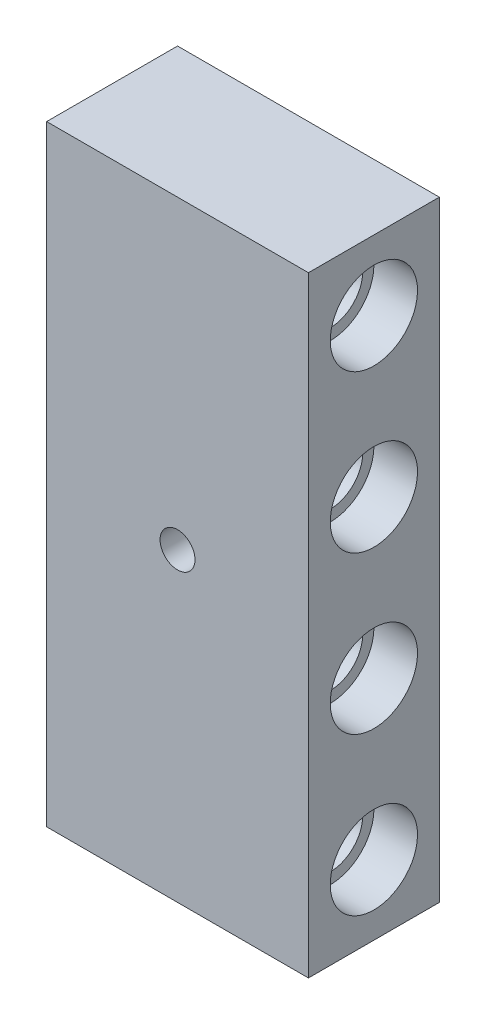
ISO-10303-21;
HEADER;
FILE_DESCRIPTION(('STEP AP214'),'2;1');
FILE_NAME('part.step','',(''),(''),'','','');
FILE_SCHEMA(('AUTOMOTIVE_DESIGN { 1 0 10303 214 1 1 1 1 }'));
ENDSEC;
DATA;
#1=APPLICATION_CONTEXT('core data for automotive mechanical design processes');
#2=APPLICATION_PROTOCOL_DEFINITION('international standard','automotive_design',2000,#1);
#3=PRODUCT_CONTEXT('',#1,'mechanical');
#4=PRODUCT('Part','Part','',(#3));
#5=PRODUCT_RELATED_PRODUCT_CATEGORY('part','',(#4));
#6=PRODUCT_DEFINITION_FORMATION('','',#4);
#7=PRODUCT_DEFINITION_CONTEXT('part definition',#1,'design');
#8=PRODUCT_DEFINITION('design','',#6,#7);
#9=PRODUCT_DEFINITION_SHAPE('','',#8);
#10=(LENGTH_UNIT() NAMED_UNIT(*) SI_UNIT(.MILLI.,.METRE.));
#11=(NAMED_UNIT(*) PLANE_ANGLE_UNIT() SI_UNIT($,.RADIAN.));
#12=(NAMED_UNIT(*) SI_UNIT($,.STERADIAN.) SOLID_ANGLE_UNIT());
#13=UNCERTAINTY_MEASURE_WITH_UNIT(LENGTH_MEASURE(1.E-05),#10,'distance_accuracy_value','');
#14=(GEOMETRIC_REPRESENTATION_CONTEXT(3) GLOBAL_UNCERTAINTY_ASSIGNED_CONTEXT((#13)) GLOBAL_UNIT_ASSIGNED_CONTEXT((#10,
#11,#12)) REPRESENTATION_CONTEXT('',''));
#15=CARTESIAN_POINT('',(0.,0.,0.));
#16=DIRECTION('',(0.,0.,1.));
#17=DIRECTION('',(1.,0.,0.));
#18=AXIS2_PLACEMENT_3D('',#15,#16,#17);
#19=CARTESIAN_POINT('',(0.,39.37,4.76249999999989));
#20=DIRECTION('',(1.,0.,0.));
#21=DIRECTION('',(0.,0.,-1.));
#22=AXIS2_PLACEMENT_3D('',#19,#20,#21);
#23=CYLINDRICAL_SURFACE('',#22,2.3622);
#24=CARTESIAN_POINT('',(15.875,39.37,4.76249999999989));
#25=DIRECTION('',(1.,0.,0.));
#26=DIRECTION('',(0.,1.,0.));
#27=AXIS2_PLACEMENT_3D('',#24,#25,#26);
#28=CIRCLE('',#27,2.3622);
#29=CARTESIAN_POINT('',(15.875,41.7322,4.76249999999989));
#30=VERTEX_POINT('',#29);
#31=EDGE_CURVE('E142',#30,#30,#28,.F.);
#32=ORIENTED_EDGE('',*,*,#31,.F.);
#33=EDGE_LOOP('',(#32));
#34=FACE_BOUND('',#33,.T.);
#35=CARTESIAN_POINT('',(3.175,39.37,4.76249999999989));
#36=DIRECTION('',(1.,0.,0.));
#37=DIRECTION('',(0.,1.,0.));
#38=AXIS2_PLACEMENT_3D('',#35,#36,#37);
#39=CIRCLE('',#38,2.3622);
#40=CARTESIAN_POINT('',(3.175,41.7322,4.76249999999989));
#41=VERTEX_POINT('',#40);
#42=EDGE_CURVE('E178',#41,#41,#39,.F.);
#43=ORIENTED_EDGE('',*,*,#42,.T.);
#44=EDGE_LOOP('',(#43));
#45=FACE_BOUND('',#44,.T.);
#46=ADVANCED_FACE('F33',(#34,#45),#23,.F.);
#47=CARTESIAN_POINT('',(0.,27.94,4.76249999999993));
#48=DIRECTION('',(1.,0.,0.));
#49=DIRECTION('',(0.,0.,-1.));
#50=AXIS2_PLACEMENT_3D('',#47,#48,#49);
#51=CYLINDRICAL_SURFACE('',#50,2.3622);
#52=CARTESIAN_POINT('',(15.875,27.94,4.76249999999993));
#53=DIRECTION('',(1.,0.,0.));
#54=DIRECTION('',(0.,1.,0.));
#55=AXIS2_PLACEMENT_3D('',#52,#53,#54);
#56=CIRCLE('',#55,2.3622);
#57=CARTESIAN_POINT('',(15.875,30.3022,4.76249999999993));
#58=VERTEX_POINT('',#57);
#59=EDGE_CURVE('E133',#58,#58,#56,.F.);
#60=ORIENTED_EDGE('',*,*,#59,.F.);
#61=EDGE_LOOP('',(#60));
#62=FACE_BOUND('',#61,.T.);
#63=CARTESIAN_POINT('',(3.175,27.94,4.76249999999993));
#64=DIRECTION('',(1.,0.,0.));
#65=DIRECTION('',(0.,1.,0.));
#66=AXIS2_PLACEMENT_3D('',#63,#64,#65);
#67=CIRCLE('',#66,2.3622);
#68=CARTESIAN_POINT('',(3.175,30.3022,4.76249999999993));
#69=VERTEX_POINT('',#68);
#70=EDGE_CURVE('E169',#69,#69,#67,.F.);
#71=ORIENTED_EDGE('',*,*,#70,.T.);
#72=EDGE_LOOP('',(#71));
#73=FACE_BOUND('',#72,.T.);
#74=ADVANCED_FACE('F227',(#62,#73),#51,.F.);
#75=CARTESIAN_POINT('',(0.,16.51,4.76249999999993));
#76=DIRECTION('',(1.,0.,0.));
#77=DIRECTION('',(0.,0.,-1.));
#78=AXIS2_PLACEMENT_3D('',#75,#76,#77);
#79=CYLINDRICAL_SURFACE('',#78,2.3622);
#80=CARTESIAN_POINT('',(15.875,16.51,4.76249999999993));
#81=DIRECTION('',(1.,0.,0.));
#82=DIRECTION('',(0.,1.,0.));
#83=AXIS2_PLACEMENT_3D('',#80,#81,#82);
#84=CIRCLE('',#83,2.3622);
#85=CARTESIAN_POINT('',(15.875,18.8722,4.76249999999993));
#86=VERTEX_POINT('',#85);
#87=EDGE_CURVE('E132',#86,#86,#84,.F.);
#88=ORIENTED_EDGE('',*,*,#87,.F.);
#89=EDGE_LOOP('',(#88));
#90=FACE_BOUND('',#89,.T.);
#91=CARTESIAN_POINT('',(3.175,16.51,4.76249999999993));
#92=DIRECTION('',(1.,0.,0.));
#93=DIRECTION('',(0.,1.,0.));
#94=AXIS2_PLACEMENT_3D('',#91,#92,#93);
#95=CIRCLE('',#94,2.3622);
#96=CARTESIAN_POINT('',(3.175,18.8722,4.76249999999993));
#97=VERTEX_POINT('',#96);
#98=EDGE_CURVE('E168',#97,#97,#95,.F.);
#99=ORIENTED_EDGE('',*,*,#98,.T.);
#100=EDGE_LOOP('',(#99));
#101=FACE_BOUND('',#100,.T.);
#102=ADVANCED_FACE('F233',(#90,#101),#79,.F.);
#103=CARTESIAN_POINT('',(0.,5.08,4.76249999999989));
#104=DIRECTION('',(1.,0.,0.));
#105=DIRECTION('',(0.,0.,-1.));
#106=AXIS2_PLACEMENT_3D('',#103,#104,#105);
#107=CYLINDRICAL_SURFACE('',#106,2.3622);
#108=CARTESIAN_POINT('',(15.875,5.08,4.76249999999989));
#109=DIRECTION('',(1.,0.,0.));
#110=DIRECTION('',(0.,1.,0.));
#111=AXIS2_PLACEMENT_3D('',#108,#109,#110);
#112=CIRCLE('',#111,2.3622);
#113=CARTESIAN_POINT('',(15.875,7.4422,4.76249999999989));
#114=VERTEX_POINT('',#113);
#115=EDGE_CURVE('E123',#114,#114,#112,.F.);
#116=ORIENTED_EDGE('',*,*,#115,.F.);
#117=EDGE_LOOP('',(#116));
#118=FACE_BOUND('',#117,.T.);
#119=CARTESIAN_POINT('',(3.175,5.08,4.76249999999989));
#120=DIRECTION('',(1.,0.,0.));
#121=DIRECTION('',(0.,1.,0.));
#122=AXIS2_PLACEMENT_3D('',#119,#120,#121);
#123=CIRCLE('',#122,2.3622);
#124=CARTESIAN_POINT('',(3.175,7.4422,4.76249999999989));
#125=VERTEX_POINT('',#124);
#126=EDGE_CURVE('E159',#125,#125,#123,.F.);
#127=ORIENTED_EDGE('',*,*,#126,.T.);
#128=EDGE_LOOP('',(#127));
#129=FACE_BOUND('',#128,.T.);
#130=ADVANCED_FACE('F253',(#118,#129),#107,.F.);
#131=CARTESIAN_POINT('',(19.05,0.,9.525));
#132=DIRECTION('',(-1.,0.,0.));
#133=DIRECTION('',(0.,-1.,0.));
#134=AXIS2_PLACEMENT_3D('',#131,#132,#133);
#135=PLANE('',#134);
#136=CARTESIAN_POINT('',(19.05,27.94,4.76249999999993));
#137=DIRECTION('',(1.,0.,0.));
#138=DIRECTION('',(0.,1.,0.));
#139=AXIS2_PLACEMENT_3D('',#136,#137,#138);
#140=CIRCLE('',#139,3.175);
#141=CARTESIAN_POINT('',(19.05,31.115,4.76249999999993));
#142=VERTEX_POINT('',#141);
#143=EDGE_CURVE('E138',#142,#142,#140,.F.);
#144=ORIENTED_EDGE('',*,*,#143,.T.);
#145=EDGE_LOOP('',(#144));
#146=FACE_BOUND('',#145,.T.);
#147=CARTESIAN_POINT('',(19.05,16.51,4.76249999999993));
#148=DIRECTION('',(1.,0.,0.));
#149=DIRECTION('',(0.,1.,0.));
#150=AXIS2_PLACEMENT_3D('',#147,#148,#149);
#151=CIRCLE('',#150,3.175);
#152=CARTESIAN_POINT('',(19.05,19.685,4.76249999999993));
#153=VERTEX_POINT('',#152);
#154=EDGE_CURVE('E129',#153,#153,#151,.T.);
#155=ORIENTED_EDGE('',*,*,#154,.F.);
#156=EDGE_LOOP('',(#155));
#157=FACE_BOUND('',#156,.T.);
#158=CARTESIAN_POINT('',(19.05,5.08,4.76249999999989));
#159=DIRECTION('',(1.,0.,0.));
#160=DIRECTION('',(0.,1.,0.));
#161=AXIS2_PLACEMENT_3D('',#158,#159,#160);
#162=CIRCLE('',#161,3.175);
#163=CARTESIAN_POINT('',(19.05,8.255,4.76249999999989));
#164=VERTEX_POINT('',#163);
#165=EDGE_CURVE('E120',#164,#164,#162,.T.);
#166=ORIENTED_EDGE('',*,*,#165,.F.);
#167=EDGE_LOOP('',(#166));
#168=FACE_BOUND('',#167,.T.);
#169=DIRECTION('',(0.,1.,0.));
#170=VECTOR('',#169,1.);
#171=CARTESIAN_POINT('',(19.05,0.,0.));
#172=LINE('',#171,#170);
#173=CARTESIAN_POINT('',(19.05,0.,0.));
#174=VERTEX_POINT('',#173);
#175=CARTESIAN_POINT('',(19.05,44.45,0.));
#176=VERTEX_POINT('',#175);
#177=EDGE_CURVE('E67',#174,#176,#172,.T.);
#178=ORIENTED_EDGE('',*,*,#177,.T.);
#179=DIRECTION('',(0.,0.,-1.));
#180=VECTOR('',#179,1.);
#181=CARTESIAN_POINT('',(19.05,44.45,9.525));
#182=LINE('',#181,#180);
#183=CARTESIAN_POINT('',(19.05,44.45,9.525));
#184=VERTEX_POINT('',#183);
#185=EDGE_CURVE('E91',#184,#176,#182,.T.);
#186=ORIENTED_EDGE('',*,*,#185,.F.);
#187=DIRECTION('',(0.,1.,0.));
#188=VECTOR('',#187,1.);
#189=CARTESIAN_POINT('',(19.05,0.,9.525));
#190=LINE('',#189,#188);
#191=CARTESIAN_POINT('',(19.05,0.,9.525));
#192=VERTEX_POINT('',#191);
#193=EDGE_CURVE('E84',#192,#184,#190,.T.);
#194=ORIENTED_EDGE('',*,*,#193,.F.);
#195=DIRECTION('',(0.,0.,-1.));
#196=VECTOR('',#195,1.);
#197=CARTESIAN_POINT('',(19.05,0.,9.525));
#198=LINE('',#197,#196);
#199=EDGE_CURVE('E42',#192,#174,#198,.T.);
#200=ORIENTED_EDGE('',*,*,#199,.T.);
#201=EDGE_LOOP('',(#178,#186,#194,#200));
#202=FACE_BOUND('',#201,.T.);
#203=CARTESIAN_POINT('',(19.05,39.37,4.76249999999989));
#204=DIRECTION('',(1.,0.,0.));
#205=DIRECTION('',(0.,1.,0.));
#206=AXIS2_PLACEMENT_3D('',#203,#204,#205);
#207=CIRCLE('',#206,3.175);
#208=CARTESIAN_POINT('',(19.05,42.545,4.76249999999989));
#209=VERTEX_POINT('',#208);
#210=EDGE_CURVE('E147',#209,#209,#207,.F.);
#211=ORIENTED_EDGE('',*,*,#210,.T.);
#212=EDGE_LOOP('',(#211));
#213=FACE_BOUND('',#212,.T.);
#214=ADVANCED_FACE('F92',(#146,#157,#168,#202,#213),#135,.F.);
#215=CARTESIAN_POINT('',(0.,0.,9.525));
#216=DIRECTION('',(0.,0.,-1.));
#217=DIRECTION('',(-1.,0.,0.));
#218=AXIS2_PLACEMENT_3D('',#215,#216,#217);
#219=PLANE('',#218);
#220=DIRECTION('',(0.,-1.,0.));
#221=VECTOR('',#220,1.);
#222=CARTESIAN_POINT('',(0.,0.,9.525));
#223=LINE('',#222,#221);
#224=CARTESIAN_POINT('',(0.,44.45,9.525));
#225=VERTEX_POINT('',#224);
#226=CARTESIAN_POINT('',(0.,0.,9.525));
#227=VERTEX_POINT('',#226);
#228=EDGE_CURVE('E86',#225,#227,#223,.T.);
#229=ORIENTED_EDGE('',*,*,#228,.T.);
#230=DIRECTION('',(1.,0.,0.));
#231=VECTOR('',#230,1.);
#232=CARTESIAN_POINT('',(0.,0.,9.525));
#233=LINE('',#232,#231);
#234=EDGE_CURVE('E80',#227,#192,#233,.T.);
#235=ORIENTED_EDGE('',*,*,#234,.T.);
#236=ORIENTED_EDGE('',*,*,#193,.T.);
#237=DIRECTION('',(-1.,0.,0.));
#238=VECTOR('',#237,1.);
#239=CARTESIAN_POINT('',(0.,44.45,9.525));
#240=LINE('',#239,#238);
#241=EDGE_CURVE('E50',#184,#225,#240,.T.);
#242=ORIENTED_EDGE('',*,*,#241,.T.);
#243=EDGE_LOOP('',(#229,#235,#236,#242));
#244=FACE_BOUND('',#243,.T.);
#245=CARTESIAN_POINT('',(9.52499999999999,22.225,9.525));
#246=DIRECTION('',(0.,0.,1.));
#247=DIRECTION('',(1.,0.,0.));
#248=AXIS2_PLACEMENT_3D('',#245,#246,#247);
#249=CIRCLE('',#248,1.27);
#250=CARTESIAN_POINT('',(8.25499999999999,22.225,9.525));
#251=VERTEX_POINT('',#250);
#252=EDGE_CURVE('E102',#251,#251,#249,.T.);
#253=ORIENTED_EDGE('',*,*,#252,.F.);
#254=EDGE_LOOP('',(#253));
#255=FACE_BOUND('',#254,.T.);
#256=ADVANCED_FACE('F81',(#244,#255),#219,.F.);
#257=CARTESIAN_POINT('',(0.,0.,0.));
#258=DIRECTION('',(0.,0.,-1.));
#259=DIRECTION('',(-1.,0.,0.));
#260=AXIS2_PLACEMENT_3D('',#257,#258,#259);
#261=PLANE('',#260);
#262=DIRECTION('',(0.,-1.,0.));
#263=VECTOR('',#262,1.);
#264=CARTESIAN_POINT('',(0.,0.,0.));
#265=LINE('',#264,#263);
#266=CARTESIAN_POINT('',(0.,44.45,0.));
#267=VERTEX_POINT('',#266);
#268=CARTESIAN_POINT('',(0.,0.,0.));
#269=VERTEX_POINT('',#268);
#270=EDGE_CURVE('E99',#267,#269,#265,.T.);
#271=ORIENTED_EDGE('',*,*,#270,.F.);
#272=DIRECTION('',(-1.,0.,0.));
#273=VECTOR('',#272,1.);
#274=CARTESIAN_POINT('',(0.,44.45,0.));
#275=LINE('',#274,#273);
#276=EDGE_CURVE('E73',#176,#267,#275,.T.);
#277=ORIENTED_EDGE('',*,*,#276,.F.);
#278=ORIENTED_EDGE('',*,*,#177,.F.);
#279=DIRECTION('',(1.,0.,0.));
#280=VECTOR('',#279,1.);
#281=CARTESIAN_POINT('',(0.,0.,0.));
#282=LINE('',#281,#280);
#283=EDGE_CURVE('E90',#269,#174,#282,.T.);
#284=ORIENTED_EDGE('',*,*,#283,.F.);
#285=EDGE_LOOP('',(#271,#277,#278,#284));
#286=FACE_BOUND('',#285,.T.);
#287=CARTESIAN_POINT('',(9.52499999999999,22.225,0.));
#288=DIRECTION('',(0.,0.,1.));
#289=DIRECTION('',(1.,0.,0.));
#290=AXIS2_PLACEMENT_3D('',#287,#288,#289);
#291=CIRCLE('',#290,1.27);
#292=CARTESIAN_POINT('',(8.25499999999999,22.225,0.));
#293=VERTEX_POINT('',#292);
#294=EDGE_CURVE('E114',#293,#293,#291,.T.);
#295=ORIENTED_EDGE('',*,*,#294,.T.);
#296=EDGE_LOOP('',(#295));
#297=FACE_BOUND('',#296,.T.);
#298=ADVANCED_FACE('F110',(#286,#297),#261,.T.);
#299=CARTESIAN_POINT('',(0.,0.,9.525));
#300=DIRECTION('',(1.,0.,0.));
#301=DIRECTION('',(0.,1.,0.));
#302=AXIS2_PLACEMENT_3D('',#299,#300,#301);
#303=PLANE('',#302);
#304=CARTESIAN_POINT('',(0.,39.37,4.76249999999989));
#305=DIRECTION('',(1.,0.,0.));
#306=DIRECTION('',(0.,1.,0.));
#307=AXIS2_PLACEMENT_3D('',#304,#305,#306);
#308=CIRCLE('',#307,3.175);
#309=CARTESIAN_POINT('',(0.,42.545,4.76249999999989));
#310=VERTEX_POINT('',#309);
#311=EDGE_CURVE('E183',#310,#310,#308,.F.);
#312=ORIENTED_EDGE('',*,*,#311,.F.);
#313=EDGE_LOOP('',(#312));
#314=FACE_BOUND('',#313,.T.);
#315=CARTESIAN_POINT('',(0.,27.94,4.76249999999993));
#316=DIRECTION('',(1.,0.,0.));
#317=DIRECTION('',(0.,1.,0.));
#318=AXIS2_PLACEMENT_3D('',#315,#316,#317);
#319=CIRCLE('',#318,3.175);
#320=CARTESIAN_POINT('',(0.,31.115,4.76249999999993));
#321=VERTEX_POINT('',#320);
#322=EDGE_CURVE('E174',#321,#321,#319,.F.);
#323=ORIENTED_EDGE('',*,*,#322,.F.);
#324=EDGE_LOOP('',(#323));
#325=FACE_BOUND('',#324,.T.);
#326=CARTESIAN_POINT('',(0.,16.51,4.76249999999993));
#327=DIRECTION('',(1.,0.,0.));
#328=DIRECTION('',(0.,1.,0.));
#329=AXIS2_PLACEMENT_3D('',#326,#327,#328);
#330=CIRCLE('',#329,3.175);
#331=CARTESIAN_POINT('',(0.,19.685,4.76249999999993));
#332=VERTEX_POINT('',#331);
#333=EDGE_CURVE('E165',#332,#332,#330,.T.);
#334=ORIENTED_EDGE('',*,*,#333,.T.);
#335=EDGE_LOOP('',(#334));
#336=FACE_BOUND('',#335,.T.);
#337=CARTESIAN_POINT('',(0.,5.08,4.76249999999989));
#338=DIRECTION('',(1.,0.,0.));
#339=DIRECTION('',(0.,1.,0.));
#340=AXIS2_PLACEMENT_3D('',#337,#338,#339);
#341=CIRCLE('',#340,3.175);
#342=CARTESIAN_POINT('',(0.,8.255,4.76249999999989));
#343=VERTEX_POINT('',#342);
#344=EDGE_CURVE('E156',#343,#343,#341,.T.);
#345=ORIENTED_EDGE('',*,*,#344,.T.);
#346=EDGE_LOOP('',(#345));
#347=FACE_BOUND('',#346,.T.);
#348=ORIENTED_EDGE('',*,*,#270,.T.);
#349=DIRECTION('',(0.,0.,-1.));
#350=VECTOR('',#349,1.);
#351=CARTESIAN_POINT('',(0.,0.,9.525));
#352=LINE('',#351,#350);
#353=EDGE_CURVE('E11',#227,#269,#352,.T.);
#354=ORIENTED_EDGE('',*,*,#353,.F.);
#355=ORIENTED_EDGE('',*,*,#228,.F.);
#356=DIRECTION('',(0.,0.,-1.));
#357=VECTOR('',#356,1.);
#358=CARTESIAN_POINT('',(0.,44.45,9.525));
#359=LINE('',#358,#357);
#360=EDGE_CURVE('E95',#225,#267,#359,.T.);
#361=ORIENTED_EDGE('',*,*,#360,.T.);
#362=EDGE_LOOP('',(#348,#354,#355,#361));
#363=FACE_BOUND('',#362,.T.);
#364=ADVANCED_FACE('F35',(#314,#325,#336,#347,#363),#303,.F.);
#365=CARTESIAN_POINT('',(0.,0.,9.525));
#366=DIRECTION('',(0.,1.,0.));
#367=DIRECTION('',(0.,0.,1.));
#368=AXIS2_PLACEMENT_3D('',#365,#366,#367);
#369=PLANE('',#368);
#370=ORIENTED_EDGE('',*,*,#283,.T.);
#371=ORIENTED_EDGE('',*,*,#199,.F.);
#372=ORIENTED_EDGE('',*,*,#234,.F.);
#373=ORIENTED_EDGE('',*,*,#353,.T.);
#374=EDGE_LOOP('',(#370,#371,#372,#373));
#375=FACE_BOUND('',#374,.T.);
#376=ADVANCED_FACE('F89',(#375),#369,.F.);
#377=CARTESIAN_POINT('',(0.,44.45,9.525));
#378=DIRECTION('',(0.,-1.,0.));
#379=DIRECTION('',(0.,0.,-1.));
#380=AXIS2_PLACEMENT_3D('',#377,#378,#379);
#381=PLANE('',#380);
#382=ORIENTED_EDGE('',*,*,#276,.T.);
#383=ORIENTED_EDGE('',*,*,#360,.F.);
#384=ORIENTED_EDGE('',*,*,#241,.F.);
#385=ORIENTED_EDGE('',*,*,#185,.T.);
#386=EDGE_LOOP('',(#382,#383,#384,#385));
#387=FACE_BOUND('',#386,.T.);
#388=ADVANCED_FACE('F107',(#387),#381,.F.);
#389=CARTESIAN_POINT('',(9.52499999999999,22.225,9.525));
#390=DIRECTION('',(0.,0.,-1.));
#391=DIRECTION('',(-1.,0.,0.));
#392=AXIS2_PLACEMENT_3D('',#389,#390,#391);
#393=CYLINDRICAL_SURFACE('',#392,1.27);
#394=CARTESIAN_POINT('',(8.25499999999999,22.225,9.525));
#395=CARTESIAN_POINT('',(8.25499999999999,22.225,9.42578125));
#396=CARTESIAN_POINT('',(8.25499999999999,22.225,9.3265625));
#397=CARTESIAN_POINT('',(8.25499999999999,22.225,9.128125));
#398=CARTESIAN_POINT('',(8.25499999999999,22.225,9.02890625));
#399=CARTESIAN_POINT('',(8.25499999999999,22.225,8.83046875));
#400=CARTESIAN_POINT('',(8.25499999999999,22.225,8.73125));
#401=CARTESIAN_POINT('',(8.25499999999999,22.225,8.5328125));
#402=CARTESIAN_POINT('',(8.25499999999999,22.225,8.43359375));
#403=CARTESIAN_POINT('',(8.25499999999999,22.225,8.23515625));
#404=CARTESIAN_POINT('',(8.25499999999999,22.225,8.1359375));
#405=CARTESIAN_POINT('',(8.25499999999999,22.225,7.9375));
#406=CARTESIAN_POINT('',(8.25499999999999,22.225,7.83828125));
#407=CARTESIAN_POINT('',(8.25499999999999,22.225,7.63984375));
#408=CARTESIAN_POINT('',(8.25499999999999,22.225,7.540625));
#409=CARTESIAN_POINT('',(8.25499999999999,22.225,7.3421875));
#410=CARTESIAN_POINT('',(8.25499999999999,22.225,7.24296875));
#411=CARTESIAN_POINT('',(8.25499999999999,22.225,7.04453125));
#412=CARTESIAN_POINT('',(8.25499999999999,22.225,6.9453125));
#413=CARTESIAN_POINT('',(8.25499999999999,22.225,6.746875));
#414=CARTESIAN_POINT('',(8.25499999999999,22.225,6.64765625));
#415=CARTESIAN_POINT('',(8.25499999999999,22.225,6.44921875));
#416=CARTESIAN_POINT('',(8.25499999999999,22.225,6.35));
#417=CARTESIAN_POINT('',(8.25499999999999,22.225,6.1515625));
#418=CARTESIAN_POINT('',(8.25499999999999,22.225,6.05234375));
#419=CARTESIAN_POINT('',(8.25499999999999,22.225,5.85390625));
#420=CARTESIAN_POINT('',(8.25499999999999,22.225,5.7546875));
#421=CARTESIAN_POINT('',(8.25499999999999,22.225,5.55625));
#422=CARTESIAN_POINT('',(8.25499999999999,22.225,5.45703125));
#423=CARTESIAN_POINT('',(8.25499999999999,22.225,5.25859375));
#424=CARTESIAN_POINT('',(8.25499999999999,22.225,5.159375));
#425=CARTESIAN_POINT('',(8.25499999999999,22.225,4.9609375));
#426=CARTESIAN_POINT('',(8.25499999999999,22.225,4.86171875));
#427=CARTESIAN_POINT('',(8.25499999999999,22.225,4.66328125));
#428=CARTESIAN_POINT('',(8.25499999999999,22.225,4.5640625));
#429=CARTESIAN_POINT('',(8.25499999999999,22.225,4.365625));
#430=CARTESIAN_POINT('',(8.25499999999999,22.225,4.26640625));
#431=CARTESIAN_POINT('',(8.25499999999999,22.225,4.06796875));
#432=CARTESIAN_POINT('',(8.25499999999999,22.225,3.96875));
#433=CARTESIAN_POINT('',(8.25499999999999,22.225,3.7703125));
#434=CARTESIAN_POINT('',(8.25499999999999,22.225,3.67109375));
#435=CARTESIAN_POINT('',(8.25499999999999,22.225,3.47265625));
#436=CARTESIAN_POINT('',(8.25499999999999,22.225,3.3734375));
#437=CARTESIAN_POINT('',(8.25499999999999,22.225,3.175));
#438=CARTESIAN_POINT('',(8.25499999999999,22.225,3.07578125));
#439=CARTESIAN_POINT('',(8.25499999999999,22.225,2.87734375));
#440=CARTESIAN_POINT('',(8.25499999999999,22.225,2.778125));
#441=CARTESIAN_POINT('',(8.25499999999999,22.225,2.5796875));
#442=CARTESIAN_POINT('',(8.25499999999999,22.225,2.48046875));
#443=CARTESIAN_POINT('',(8.25499999999999,22.225,2.28203125));
#444=CARTESIAN_POINT('',(8.25499999999999,22.225,2.1828125));
#445=CARTESIAN_POINT('',(8.25499999999999,22.225,1.984375));
#446=CARTESIAN_POINT('',(8.25499999999999,22.225,1.88515625));
#447=CARTESIAN_POINT('',(8.25499999999999,22.225,1.68671875));
#448=CARTESIAN_POINT('',(8.25499999999999,22.225,1.5875));
#449=CARTESIAN_POINT('',(8.25499999999999,22.225,1.3890625));
#450=CARTESIAN_POINT('',(8.25499999999999,22.225,1.28984375));
#451=CARTESIAN_POINT('',(8.25499999999999,22.225,1.09140625));
#452=CARTESIAN_POINT('',(8.25499999999999,22.225,0.992187500000001));
#453=CARTESIAN_POINT('',(8.25499999999999,22.225,0.793750000000001));
#454=CARTESIAN_POINT('',(8.25499999999999,22.225,0.69453125));
#455=CARTESIAN_POINT('',(8.25499999999999,22.225,0.49609375));
#456=CARTESIAN_POINT('',(8.25499999999999,22.225,0.396875));
#457=CARTESIAN_POINT('',(8.25499999999999,22.225,0.1984375));
#458=CARTESIAN_POINT('',(8.25499999999999,22.225,0.0992187500000001));
#459=CARTESIAN_POINT('',(8.25499999999999,22.225,0.));
#460=B_SPLINE_CURVE_WITH_KNOTS('',3,(#394,#395,#396,#397,#398,#399,#400,#401,#402,#403,#404,
#405,#406,#407,#408,#409,#410,#411,#412,#413,#414,#415,#416,#417,#418,#419,#420,#421,#422,#423,
#424,#425,#426,#427,#428,#429,#430,#431,#432,#433,#434,#435,#436,#437,#438,#439,#440,#441,#442,
#443,#444,#445,#446,#447,#448,#449,#450,#451,#452,#453,#454,#455,#456,#457,#458,#459),
.UNSPECIFIED.,.F.,.F.,(4,2,2,2,2,2,2,2,2,2,2,2,2,2,2,2,2,2,2,2,2,2,2,2,2,2,2,2,2,2,2,2,4),(0.,
0.297656249999998,0.595312499999999,0.892968749999999,1.190625,1.48828125,1.7859375,2.08359375,
2.38125,2.67890625,2.9765625,3.27421875,3.571875,3.86953125,4.1671875,4.46484375,4.7625,
5.06015625,5.3578125,5.65546875,5.953125,6.25078125,6.5484375,6.84609375,7.14375,7.44140625,
7.7390625,8.03671875,8.334375,8.63203125,8.9296875,9.22734375,9.525),.UNSPECIFIED.);
#461=EDGE_CURVE('BSEAM241',#251,#293,#460,.T.);
#462=ORIENTED_EDGE('',*,*,#252,.T.);
#463=ORIENTED_EDGE('',*,*,#294,.F.);
#464=ORIENTED_EDGE('',*,*,#461,.T.);
#465=ORIENTED_EDGE('',*,*,#461,.F.);
#466=EDGE_LOOP('',(#462,#464,#463,#465));
#467=FACE_BOUND('',#466,.T.);
#468=ADVANCED_FACE('F241',(#467),#393,.F.);
#469=CARTESIAN_POINT('',(15.875,5.08,4.76249999999989));
#470=DIRECTION('',(1.,0.,0.));
#471=DIRECTION('',(0.,1.,0.));
#472=AXIS2_PLACEMENT_3D('',#469,#470,#471);
#473=CYLINDRICAL_SURFACE('',#472,3.175);
#474=CARTESIAN_POINT('',(15.875,5.08,4.76249999999989));
#475=DIRECTION('',(1.,0.,0.));
#476=DIRECTION('',(0.,1.,0.));
#477=AXIS2_PLACEMENT_3D('',#474,#475,#476);
#478=CIRCLE('',#477,3.175);
#479=CARTESIAN_POINT('',(15.875,8.255,4.76249999999989));
#480=VERTEX_POINT('',#479);
#481=EDGE_CURVE('E117',#480,#480,#478,.T.);
#482=ORIENTED_EDGE('',*,*,#481,.F.);
#483=EDGE_LOOP('',(#482));
#484=FACE_BOUND('',#483,.T.);
#485=ORIENTED_EDGE('',*,*,#165,.T.);
#486=EDGE_LOOP('',(#485));
#487=FACE_BOUND('',#486,.T.);
#488=ADVANCED_FACE('F244',(#484,#487),#473,.F.);
#489=CARTESIAN_POINT('',(15.875,0.,0.));
#490=DIRECTION('',(1.,0.,0.));
#491=DIRECTION('',(0.,1.,0.));
#492=AXIS2_PLACEMENT_3D('',#489,#490,#491);
#493=PLANE('',#492);
#494=ORIENTED_EDGE('',*,*,#115,.T.);
#495=EDGE_LOOP('',(#494));
#496=FACE_BOUND('',#495,.T.);
#497=ORIENTED_EDGE('',*,*,#481,.T.);
#498=EDGE_LOOP('',(#497));
#499=FACE_BOUND('',#498,.T.);
#500=ADVANCED_FACE('F276',(#496,#499),#493,.T.);
#501=CARTESIAN_POINT('',(15.875,16.51,4.76249999999993));
#502=DIRECTION('',(1.,0.,0.));
#503=DIRECTION('',(0.,1.,0.));
#504=AXIS2_PLACEMENT_3D('',#501,#502,#503);
#505=CYLINDRICAL_SURFACE('',#504,3.175);
#506=CARTESIAN_POINT('',(15.875,16.51,4.76249999999993));
#507=DIRECTION('',(1.,0.,0.));
#508=DIRECTION('',(0.,1.,0.));
#509=AXIS2_PLACEMENT_3D('',#506,#507,#508);
#510=CIRCLE('',#509,3.175);
#511=CARTESIAN_POINT('',(15.875,19.685,4.76249999999993));
#512=VERTEX_POINT('',#511);
#513=EDGE_CURVE('E124',#512,#512,#510,.T.);
#514=ORIENTED_EDGE('',*,*,#513,.F.);
#515=EDGE_LOOP('',(#514));
#516=FACE_BOUND('',#515,.T.);
#517=ORIENTED_EDGE('',*,*,#154,.T.);
#518=EDGE_LOOP('',(#517));
#519=FACE_BOUND('',#518,.T.);
#520=ADVANCED_FACE('F284',(#516,#519),#505,.F.);
#521=CARTESIAN_POINT('',(15.875,0.,0.));
#522=DIRECTION('',(1.,0.,0.));
#523=DIRECTION('',(0.,1.,0.));
#524=AXIS2_PLACEMENT_3D('',#521,#522,#523);
#525=PLANE('',#524);
#526=ORIENTED_EDGE('',*,*,#87,.T.);
#527=EDGE_LOOP('',(#526));
#528=FACE_BOUND('',#527,.T.);
#529=ORIENTED_EDGE('',*,*,#513,.T.);
#530=EDGE_LOOP('',(#529));
#531=FACE_BOUND('',#530,.T.);
#532=ADVANCED_FACE('F292',(#528,#531),#525,.T.);
#533=CARTESIAN_POINT('',(15.875,27.94,4.76249999999993));
#534=DIRECTION('',(1.,0.,0.));
#535=DIRECTION('',(0.,1.,0.));
#536=AXIS2_PLACEMENT_3D('',#533,#534,#535);
#537=CYLINDRICAL_SURFACE('',#536,3.175);
#538=CARTESIAN_POINT('',(15.875,27.94,4.76249999999993));
#539=DIRECTION('',(1.,0.,0.));
#540=DIRECTION('',(0.,1.,0.));
#541=AXIS2_PLACEMENT_3D('',#538,#539,#540);
#542=CIRCLE('',#541,3.175);
#543=CARTESIAN_POINT('',(15.875,31.115,4.76249999999993));
#544=VERTEX_POINT('',#543);
#545=EDGE_CURVE('E141',#544,#544,#542,.F.);
#546=ORIENTED_EDGE('',*,*,#545,.T.);
#547=EDGE_LOOP('',(#546));
#548=FACE_BOUND('',#547,.T.);
#549=ORIENTED_EDGE('',*,*,#143,.F.);
#550=EDGE_LOOP('',(#549));
#551=FACE_BOUND('',#550,.T.);
#552=ADVANCED_FACE('F300',(#548,#551),#537,.F.);
#553=CARTESIAN_POINT('',(15.875,0.,0.));
#554=DIRECTION('',(1.,0.,0.));
#555=DIRECTION('',(0.,1.,0.));
#556=AXIS2_PLACEMENT_3D('',#553,#554,#555);
#557=PLANE('',#556);
#558=ORIENTED_EDGE('',*,*,#545,.F.);
#559=EDGE_LOOP('',(#558));
#560=FACE_BOUND('',#559,.T.);
#561=ORIENTED_EDGE('',*,*,#59,.T.);
#562=EDGE_LOOP('',(#561));
#563=FACE_BOUND('',#562,.T.);
#564=ADVANCED_FACE('F308',(#560,#563),#557,.T.);
#565=CARTESIAN_POINT('',(15.875,39.37,4.76249999999989));
#566=DIRECTION('',(1.,0.,0.));
#567=DIRECTION('',(0.,1.,0.));
#568=AXIS2_PLACEMENT_3D('',#565,#566,#567);
#569=CYLINDRICAL_SURFACE('',#568,3.175);
#570=CARTESIAN_POINT('',(15.875,39.37,4.76249999999989));
#571=DIRECTION('',(1.,0.,0.));
#572=DIRECTION('',(0.,1.,0.));
#573=AXIS2_PLACEMENT_3D('',#570,#571,#572);
#574=CIRCLE('',#573,3.175);
#575=CARTESIAN_POINT('',(15.875,42.545,4.76249999999989));
#576=VERTEX_POINT('',#575);
#577=EDGE_CURVE('E150',#576,#576,#574,.F.);
#578=ORIENTED_EDGE('',*,*,#577,.T.);
#579=EDGE_LOOP('',(#578));
#580=FACE_BOUND('',#579,.T.);
#581=ORIENTED_EDGE('',*,*,#210,.F.);
#582=EDGE_LOOP('',(#581));
#583=FACE_BOUND('',#582,.T.);
#584=ADVANCED_FACE('F223',(#580,#583),#569,.F.);
#585=CARTESIAN_POINT('',(15.875,0.,0.));
#586=DIRECTION('',(1.,0.,0.));
#587=DIRECTION('',(0.,1.,0.));
#588=AXIS2_PLACEMENT_3D('',#585,#586,#587);
#589=PLANE('',#588);
#590=ORIENTED_EDGE('',*,*,#577,.F.);
#591=EDGE_LOOP('',(#590));
#592=FACE_BOUND('',#591,.T.);
#593=ORIENTED_EDGE('',*,*,#31,.T.);
#594=EDGE_LOOP('',(#593));
#595=FACE_BOUND('',#594,.T.);
#596=ADVANCED_FACE('F213',(#592,#595),#589,.T.);
#597=CARTESIAN_POINT('',(3.175,5.08,4.76249999999989));
#598=DIRECTION('',(-1.,0.,0.));
#599=DIRECTION('',(0.,-1.,0.));
#600=AXIS2_PLACEMENT_3D('',#597,#598,#599);
#601=CYLINDRICAL_SURFACE('',#600,3.175);
#602=CARTESIAN_POINT('',(3.175,5.08,4.76249999999989));
#603=DIRECTION('',(1.,0.,0.));
#604=DIRECTION('',(0.,1.,0.));
#605=AXIS2_PLACEMENT_3D('',#602,#603,#604);
#606=CIRCLE('',#605,3.175);
#607=CARTESIAN_POINT('',(3.175,8.255,4.76249999999989));
#608=VERTEX_POINT('',#607);
#609=EDGE_CURVE('E151',#608,#608,#606,.T.);
#610=ORIENTED_EDGE('',*,*,#609,.T.);
#611=EDGE_LOOP('',(#610));
#612=FACE_BOUND('',#611,.T.);
#613=ORIENTED_EDGE('',*,*,#344,.F.);
#614=EDGE_LOOP('',(#613));
#615=FACE_BOUND('',#614,.T.);
#616=ADVANCED_FACE('F210',(#612,#615),#601,.F.);
#617=CARTESIAN_POINT('',(3.175,0.,0.));
#618=DIRECTION('',(-1.,0.,0.));
#619=DIRECTION('',(0.,1.,0.));
#620=AXIS2_PLACEMENT_3D('',#617,#618,#619);
#621=PLANE('',#620);
#622=ORIENTED_EDGE('',*,*,#126,.F.);
#623=EDGE_LOOP('',(#622));
#624=FACE_BOUND('',#623,.T.);
#625=ORIENTED_EDGE('',*,*,#609,.F.);
#626=EDGE_LOOP('',(#625));
#627=FACE_BOUND('',#626,.T.);
#628=ADVANCED_FACE('F212',(#624,#627),#621,.T.);
#629=CARTESIAN_POINT('',(3.175,16.51,4.76249999999993));
#630=DIRECTION('',(-1.,0.,0.));
#631=DIRECTION('',(0.,-1.,0.));
#632=AXIS2_PLACEMENT_3D('',#629,#630,#631);
#633=CYLINDRICAL_SURFACE('',#632,3.175);
#634=CARTESIAN_POINT('',(3.175,16.51,4.76249999999993));
#635=DIRECTION('',(1.,0.,0.));
#636=DIRECTION('',(0.,1.,0.));
#637=AXIS2_PLACEMENT_3D('',#634,#635,#636);
#638=CIRCLE('',#637,3.175);
#639=CARTESIAN_POINT('',(3.175,19.685,4.76249999999993));
#640=VERTEX_POINT('',#639);
#641=EDGE_CURVE('E160',#640,#640,#638,.T.);
#642=ORIENTED_EDGE('',*,*,#641,.T.);
#643=EDGE_LOOP('',(#642));
#644=FACE_BOUND('',#643,.T.);
#645=ORIENTED_EDGE('',*,*,#333,.F.);
#646=EDGE_LOOP('',(#645));
#647=FACE_BOUND('',#646,.T.);
#648=ADVANCED_FACE('F220',(#644,#647),#633,.F.);
#649=CARTESIAN_POINT('',(3.175,0.,0.));
#650=DIRECTION('',(-1.,0.,0.));
#651=DIRECTION('',(0.,1.,0.));
#652=AXIS2_PLACEMENT_3D('',#649,#650,#651);
#653=PLANE('',#652);
#654=ORIENTED_EDGE('',*,*,#98,.F.);
#655=EDGE_LOOP('',(#654));
#656=FACE_BOUND('',#655,.T.);
#657=ORIENTED_EDGE('',*,*,#641,.F.);
#658=EDGE_LOOP('',(#657));
#659=FACE_BOUND('',#658,.T.);
#660=ADVANCED_FACE('F378',(#656,#659),#653,.T.);
#661=CARTESIAN_POINT('',(3.175,27.94,4.76249999999993));
#662=DIRECTION('',(-1.,0.,0.));
#663=DIRECTION('',(0.,-1.,0.));
#664=AXIS2_PLACEMENT_3D('',#661,#662,#663);
#665=CYLINDRICAL_SURFACE('',#664,3.175);
#666=CARTESIAN_POINT('',(3.175,27.94,4.76249999999993));
#667=DIRECTION('',(1.,0.,0.));
#668=DIRECTION('',(0.,1.,0.));
#669=AXIS2_PLACEMENT_3D('',#666,#667,#668);
#670=CIRCLE('',#669,3.175);
#671=CARTESIAN_POINT('',(3.175,31.115,4.76249999999993));
#672=VERTEX_POINT('',#671);
#673=EDGE_CURVE('E177',#672,#672,#670,.F.);
#674=ORIENTED_EDGE('',*,*,#673,.F.);
#675=EDGE_LOOP('',(#674));
#676=FACE_BOUND('',#675,.T.);
#677=ORIENTED_EDGE('',*,*,#322,.T.);
#678=EDGE_LOOP('',(#677));
#679=FACE_BOUND('',#678,.T.);
#680=ADVANCED_FACE('F388',(#676,#679),#665,.F.);
#681=CARTESIAN_POINT('',(3.175,0.,0.));
#682=DIRECTION('',(-1.,0.,0.));
#683=DIRECTION('',(0.,1.,0.));
#684=AXIS2_PLACEMENT_3D('',#681,#682,#683);
#685=PLANE('',#684);
#686=ORIENTED_EDGE('',*,*,#673,.T.);
#687=EDGE_LOOP('',(#686));
#688=FACE_BOUND('',#687,.T.);
#689=ORIENTED_EDGE('',*,*,#70,.F.);
#690=EDGE_LOOP('',(#689));
#691=FACE_BOUND('',#690,.T.);
#692=ADVANCED_FACE('F198',(#688,#691),#685,.T.);
#693=CARTESIAN_POINT('',(3.175,39.37,4.76249999999989));
#694=DIRECTION('',(-1.,0.,0.));
#695=DIRECTION('',(0.,-1.,0.));
#696=AXIS2_PLACEMENT_3D('',#693,#694,#695);
#697=CYLINDRICAL_SURFACE('',#696,3.175);
#698=CARTESIAN_POINT('',(3.175,39.37,4.76249999999989));
#699=DIRECTION('',(1.,0.,0.));
#700=DIRECTION('',(0.,1.,0.));
#701=AXIS2_PLACEMENT_3D('',#698,#699,#700);
#702=CIRCLE('',#701,3.175);
#703=CARTESIAN_POINT('',(3.175,42.545,4.76249999999989));
#704=VERTEX_POINT('',#703);
#705=EDGE_CURVE('E186',#704,#704,#702,.F.);
#706=ORIENTED_EDGE('',*,*,#705,.F.);
#707=EDGE_LOOP('',(#706));
#708=FACE_BOUND('',#707,.T.);
#709=ORIENTED_EDGE('',*,*,#311,.T.);
#710=EDGE_LOOP('',(#709));
#711=FACE_BOUND('',#710,.T.);
#712=ADVANCED_FACE('F195',(#708,#711),#697,.F.);
#713=CARTESIAN_POINT('',(3.175,0.,0.));
#714=DIRECTION('',(-1.,0.,0.));
#715=DIRECTION('',(0.,1.,0.));
#716=AXIS2_PLACEMENT_3D('',#713,#714,#715);
#717=PLANE('',#716);
#718=ORIENTED_EDGE('',*,*,#705,.T.);
#719=EDGE_LOOP('',(#718));
#720=FACE_BOUND('',#719,.T.);
#721=ORIENTED_EDGE('',*,*,#42,.F.);
#722=EDGE_LOOP('',(#721));
#723=FACE_BOUND('',#722,.T.);
#724=ADVANCED_FACE('F192',(#720,#723),#717,.T.);
#725=CLOSED_SHELL('',(#46,#74,#102,#130,#214,#256,#298,#364,#376,#388,#468,#488,#500,#520,#532,
#552,#564,#584,#596,#616,#628,#648,#660,#680,#692,#712,#724));
#726=MANIFOLD_SOLID_BREP('B2',#725);
#727=ADVANCED_BREP_SHAPE_REPRESENTATION('',(#18,#726),#14);
#728=SHAPE_DEFINITION_REPRESENTATION(#9,#727);
ENDSEC;
END-ISO-10303-21;
